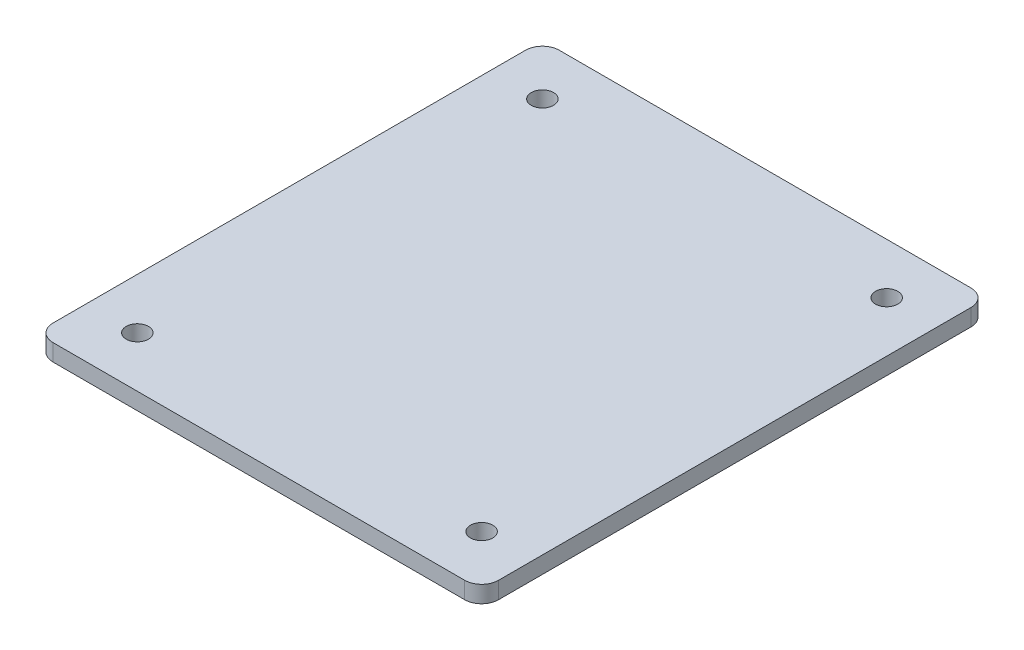
ISO-10303-21;
HEADER;
FILE_DESCRIPTION(('STEP AP214'),'2;1');
FILE_NAME('part.step','',(''),(''),'','','');
FILE_SCHEMA(('AUTOMOTIVE_DESIGN { 1 0 10303 214 1 1 1 1 }'));
ENDSEC;
DATA;
#1=APPLICATION_CONTEXT('core data for automotive mechanical design processes');
#2=APPLICATION_PROTOCOL_DEFINITION('international standard','automotive_design',2000,#1);
#3=PRODUCT_CONTEXT('',#1,'mechanical');
#4=PRODUCT('Part','Part','',(#3));
#5=PRODUCT_RELATED_PRODUCT_CATEGORY('part','',(#4));
#6=PRODUCT_DEFINITION_FORMATION('','',#4);
#7=PRODUCT_DEFINITION_CONTEXT('part definition',#1,'design');
#8=PRODUCT_DEFINITION('design','',#6,#7);
#9=PRODUCT_DEFINITION_SHAPE('','',#8);
#10=(LENGTH_UNIT() NAMED_UNIT(*) SI_UNIT(.MILLI.,.METRE.));
#11=(NAMED_UNIT(*) PLANE_ANGLE_UNIT() SI_UNIT($,.RADIAN.));
#12=(NAMED_UNIT(*) SI_UNIT($,.STERADIAN.) SOLID_ANGLE_UNIT());
#13=UNCERTAINTY_MEASURE_WITH_UNIT(LENGTH_MEASURE(1.E-05),#10,'distance_accuracy_value','');
#14=(GEOMETRIC_REPRESENTATION_CONTEXT(3) GLOBAL_UNCERTAINTY_ASSIGNED_CONTEXT((#13)) GLOBAL_UNIT_ASSIGNED_CONTEXT((#10,
#11,#12)) REPRESENTATION_CONTEXT('',''));
#15=CARTESIAN_POINT('',(0.,0.,0.));
#16=DIRECTION('',(0.,0.,1.));
#17=DIRECTION('',(1.,0.,0.));
#18=AXIS2_PLACEMENT_3D('',#15,#16,#17);
#19=CARTESIAN_POINT('',(0.,5.,0.));
#20=DIRECTION('',(1.,0.,0.));
#21=DIRECTION('',(0.,0.,-1.));
#22=AXIS2_PLACEMENT_3D('',#19,#20,#21);
#23=PLANE('',#22);
#24=DIRECTION('',(0.,0.,1.));
#25=VECTOR('',#24,1.);
#26=CARTESIAN_POINT('',(0.,0.,0.));
#27=LINE('',#26,#25);
#28=CARTESIAN_POINT('',(0.,0.,-145.));
#29=VERTEX_POINT('',#28);
#30=CARTESIAN_POINT('',(0.,0.,-5.));
#31=VERTEX_POINT('',#30);
#32=EDGE_CURVE('E156',#29,#31,#27,.T.);
#33=ORIENTED_EDGE('',*,*,#32,.T.);
#34=DIRECTION('',(0.,-1.,0.));
#35=VECTOR('',#34,1.);
#36=CARTESIAN_POINT('',(0.,5.,-5.));
#37=LINE('',#36,#35);
#38=CARTESIAN_POINT('',(0.,5.,-5.));
#39=VERTEX_POINT('',#38);
#40=EDGE_CURVE('E11',#31,#39,#37,.F.);
#41=ORIENTED_EDGE('',*,*,#40,.T.);
#42=DIRECTION('',(0.,0.,1.));
#43=VECTOR('',#42,1.);
#44=CARTESIAN_POINT('',(0.,5.,0.));
#45=LINE('',#44,#43);
#46=CARTESIAN_POINT('',(0.,5.,-145.));
#47=VERTEX_POINT('',#46);
#48=EDGE_CURVE('E124',#47,#39,#45,.T.);
#49=ORIENTED_EDGE('',*,*,#48,.F.);
#50=DIRECTION('',(0.,-1.,0.));
#51=VECTOR('',#50,1.);
#52=CARTESIAN_POINT('',(0.,5.,-145.));
#53=LINE('',#52,#51);
#54=EDGE_CURVE('E40',#47,#29,#53,.T.);
#55=ORIENTED_EDGE('',*,*,#54,.T.);
#56=EDGE_LOOP('',(#33,#41,#49,#55));
#57=FACE_BOUND('',#56,.T.);
#58=ADVANCED_FACE('F32',(#57),#23,.F.);
#59=CARTESIAN_POINT('',(0.,5.,0.));
#60=DIRECTION('',(0.,0.,-1.));
#61=DIRECTION('',(-1.,0.,0.));
#62=AXIS2_PLACEMENT_3D('',#59,#60,#61);
#63=PLANE('',#62);
#64=DIRECTION('',(1.,0.,0.));
#65=VECTOR('',#64,1.);
#66=CARTESIAN_POINT('',(0.,0.,0.));
#67=LINE('',#66,#65);
#68=CARTESIAN_POINT('',(5.,0.,0.));
#69=VERTEX_POINT('',#68);
#70=CARTESIAN_POINT('',(127.,0.,0.));
#71=VERTEX_POINT('',#70);
#72=EDGE_CURVE('E129',#69,#71,#67,.T.);
#73=ORIENTED_EDGE('',*,*,#72,.T.);
#74=DIRECTION('',(0.,-1.,0.));
#75=VECTOR('',#74,1.);
#76=CARTESIAN_POINT('',(127.,5.,0.));
#77=LINE('',#76,#75);
#78=CARTESIAN_POINT('',(127.,5.,0.));
#79=VERTEX_POINT('',#78);
#80=EDGE_CURVE('E47',#71,#79,#77,.F.);
#81=ORIENTED_EDGE('',*,*,#80,.T.);
#82=DIRECTION('',(1.,0.,0.));
#83=VECTOR('',#82,1.);
#84=CARTESIAN_POINT('',(0.,5.,0.));
#85=LINE('',#84,#83);
#86=CARTESIAN_POINT('',(5.,5.,0.));
#87=VERTEX_POINT('',#86);
#88=EDGE_CURVE('E127',#87,#79,#85,.T.);
#89=ORIENTED_EDGE('',*,*,#88,.F.);
#90=DIRECTION('',(0.,-1.,0.));
#91=VECTOR('',#90,1.);
#92=CARTESIAN_POINT('',(5.,5.,0.));
#93=LINE('',#92,#91);
#94=EDGE_CURVE('E148',#87,#69,#93,.T.);
#95=ORIENTED_EDGE('',*,*,#94,.T.);
#96=EDGE_LOOP('',(#73,#81,#89,#95));
#97=FACE_BOUND('',#96,.T.);
#98=ADVANCED_FACE('F223',(#97),#63,.F.);
#99=CARTESIAN_POINT('',(132.,5.,0.));
#100=DIRECTION('',(-1.,0.,0.));
#101=DIRECTION('',(0.,0.,1.));
#102=AXIS2_PLACEMENT_3D('',#99,#100,#101);
#103=PLANE('',#102);
#104=DIRECTION('',(0.,0.,-1.));
#105=VECTOR('',#104,1.);
#106=CARTESIAN_POINT('',(132.,0.,0.));
#107=LINE('',#106,#105);
#108=CARTESIAN_POINT('',(132.,0.,-5.));
#109=VERTEX_POINT('',#108);
#110=CARTESIAN_POINT('',(132.,0.,-145.));
#111=VERTEX_POINT('',#110);
#112=EDGE_CURVE('E125',#109,#111,#107,.T.);
#113=ORIENTED_EDGE('',*,*,#112,.T.);
#114=DIRECTION('',(0.,-1.,0.));
#115=VECTOR('',#114,1.);
#116=CARTESIAN_POINT('',(132.,5.,-145.));
#117=LINE('',#116,#115);
#118=CARTESIAN_POINT('',(132.,5.,-145.));
#119=VERTEX_POINT('',#118);
#120=EDGE_CURVE('E103',#111,#119,#117,.F.);
#121=ORIENTED_EDGE('',*,*,#120,.T.);
#122=DIRECTION('',(0.,0.,-1.));
#123=VECTOR('',#122,1.);
#124=CARTESIAN_POINT('',(132.,5.,0.));
#125=LINE('',#124,#123);
#126=CARTESIAN_POINT('',(132.,5.,-5.));
#127=VERTEX_POINT('',#126);
#128=EDGE_CURVE('E168',#127,#119,#125,.T.);
#129=ORIENTED_EDGE('',*,*,#128,.F.);
#130=DIRECTION('',(0.,-1.,0.));
#131=VECTOR('',#130,1.);
#132=CARTESIAN_POINT('',(132.,5.,-5.));
#133=LINE('',#132,#131);
#134=EDGE_CURVE('E108',#127,#109,#133,.T.);
#135=ORIENTED_EDGE('',*,*,#134,.T.);
#136=EDGE_LOOP('',(#113,#121,#129,#135));
#137=FACE_BOUND('',#136,.T.);
#138=ADVANCED_FACE('F220',(#137),#103,.F.);
#139=CARTESIAN_POINT('',(0.,5.,-150.));
#140=DIRECTION('',(0.,0.,1.));
#141=DIRECTION('',(1.,0.,0.));
#142=AXIS2_PLACEMENT_3D('',#139,#140,#141);
#143=PLANE('',#142);
#144=DIRECTION('',(-1.,0.,0.));
#145=VECTOR('',#144,1.);
#146=CARTESIAN_POINT('',(0.,5.,-150.));
#147=LINE('',#146,#145);
#148=CARTESIAN_POINT('',(127.,5.,-150.));
#149=VERTEX_POINT('',#148);
#150=CARTESIAN_POINT('',(5.,5.,-150.));
#151=VERTEX_POINT('',#150);
#152=EDGE_CURVE('E118',#149,#151,#147,.T.);
#153=ORIENTED_EDGE('',*,*,#152,.F.);
#154=DIRECTION('',(0.,-1.,0.));
#155=VECTOR('',#154,1.);
#156=CARTESIAN_POINT('',(127.,5.,-150.));
#157=LINE('',#156,#155);
#158=CARTESIAN_POINT('',(127.,0.,-150.));
#159=VERTEX_POINT('',#158);
#160=EDGE_CURVE('E102',#149,#159,#157,.T.);
#161=ORIENTED_EDGE('',*,*,#160,.T.);
#162=DIRECTION('',(-1.,0.,0.));
#163=VECTOR('',#162,1.);
#164=CARTESIAN_POINT('',(0.,0.,-150.));
#165=LINE('',#164,#163);
#166=CARTESIAN_POINT('',(5.,0.,-150.));
#167=VERTEX_POINT('',#166);
#168=EDGE_CURVE('E115',#159,#167,#165,.T.);
#169=ORIENTED_EDGE('',*,*,#168,.T.);
#170=DIRECTION('',(0.,-1.,0.));
#171=VECTOR('',#170,1.);
#172=CARTESIAN_POINT('',(5.,5.,-150.));
#173=LINE('',#172,#171);
#174=EDGE_CURVE('E120',#167,#151,#173,.F.);
#175=ORIENTED_EDGE('',*,*,#174,.T.);
#176=EDGE_LOOP('',(#153,#161,#169,#175));
#177=FACE_BOUND('',#176,.T.);
#178=ADVANCED_FACE('F114',(#177),#143,.F.);
#179=CARTESIAN_POINT('',(0.,5.,0.));
#180=DIRECTION('',(0.,-1.,0.));
#181=DIRECTION('',(0.,0.,-1.));
#182=AXIS2_PLACEMENT_3D('',#179,#180,#181);
#183=PLANE('',#182);
#184=CARTESIAN_POINT('',(15.,5.,-15.));
#185=DIRECTION('',(0.,-1.,0.));
#186=DIRECTION('',(0.,0.,-1.));
#187=AXIS2_PLACEMENT_3D('',#184,#185,#186);
#188=CIRCLE('',#187,3.3);
#189=CARTESIAN_POINT('',(15.,5.,-18.3));
#190=VERTEX_POINT('',#189);
#191=EDGE_CURVE('E186',#190,#190,#188,.T.);
#192=ORIENTED_EDGE('',*,*,#191,.T.);
#193=EDGE_LOOP('',(#192));
#194=FACE_BOUND('',#193,.T.);
#195=CARTESIAN_POINT('',(117.,5.,-15.));
#196=DIRECTION('',(0.,-1.,0.));
#197=DIRECTION('',(0.,0.,-1.));
#198=AXIS2_PLACEMENT_3D('',#195,#196,#197);
#199=CIRCLE('',#198,3.3);
#200=CARTESIAN_POINT('',(117.,5.,-18.3));
#201=VERTEX_POINT('',#200);
#202=EDGE_CURVE('E180',#201,#201,#199,.T.);
#203=ORIENTED_EDGE('',*,*,#202,.T.);
#204=EDGE_LOOP('',(#203));
#205=FACE_BOUND('',#204,.T.);
#206=CARTESIAN_POINT('',(117.,5.,-135.));
#207=DIRECTION('',(0.,-1.,0.));
#208=DIRECTION('',(0.,0.,-1.));
#209=AXIS2_PLACEMENT_3D('',#206,#207,#208);
#210=CIRCLE('',#209,3.3);
#211=CARTESIAN_POINT('',(117.,5.,-138.3));
#212=VERTEX_POINT('',#211);
#213=EDGE_CURVE('E174',#212,#212,#210,.T.);
#214=ORIENTED_EDGE('',*,*,#213,.T.);
#215=EDGE_LOOP('',(#214));
#216=FACE_BOUND('',#215,.T.);
#217=CARTESIAN_POINT('',(15.,5.,-135.));
#218=DIRECTION('',(0.,-1.,0.));
#219=DIRECTION('',(0.,0.,-1.));
#220=AXIS2_PLACEMENT_3D('',#217,#218,#219);
#221=CIRCLE('',#220,3.3);
#222=CARTESIAN_POINT('',(15.,5.,-138.3));
#223=VERTEX_POINT('',#222);
#224=EDGE_CURVE('E161',#223,#223,#221,.T.);
#225=ORIENTED_EDGE('',*,*,#224,.T.);
#226=EDGE_LOOP('',(#225));
#227=FACE_BOUND('',#226,.T.);
#228=ORIENTED_EDGE('',*,*,#128,.T.);
#229=CARTESIAN_POINT('',(127.,5.,-145.));
#230=DIRECTION('',(0.,-1.,0.));
#231=DIRECTION('',(0.,0.,-1.));
#232=AXIS2_PLACEMENT_3D('',#229,#230,#231);
#233=CIRCLE('',#232,5.);
#234=EDGE_CURVE('E146',#119,#149,#233,.F.);
#235=ORIENTED_EDGE('',*,*,#234,.T.);
#236=ORIENTED_EDGE('',*,*,#152,.T.);
#237=CARTESIAN_POINT('',(5.,5.,-145.));
#238=DIRECTION('',(0.,-1.,0.));
#239=DIRECTION('',(0.,0.,-1.));
#240=AXIS2_PLACEMENT_3D('',#237,#238,#239);
#241=CIRCLE('',#240,5.);
#242=EDGE_CURVE('E141',#151,#47,#241,.F.);
#243=ORIENTED_EDGE('',*,*,#242,.T.);
#244=ORIENTED_EDGE('',*,*,#48,.T.);
#245=CARTESIAN_POINT('',(5.,5.,-5.));
#246=DIRECTION('',(0.,-1.,0.));
#247=DIRECTION('',(0.,0.,-1.));
#248=AXIS2_PLACEMENT_3D('',#245,#246,#247);
#249=CIRCLE('',#248,5.);
#250=EDGE_CURVE('E54',#39,#87,#249,.F.);
#251=ORIENTED_EDGE('',*,*,#250,.T.);
#252=ORIENTED_EDGE('',*,*,#88,.T.);
#253=CARTESIAN_POINT('',(127.,5.,-5.));
#254=DIRECTION('',(0.,-1.,0.));
#255=DIRECTION('',(0.,0.,-1.));
#256=AXIS2_PLACEMENT_3D('',#253,#254,#255);
#257=CIRCLE('',#256,5.);
#258=EDGE_CURVE('E144',#79,#127,#257,.F.);
#259=ORIENTED_EDGE('',*,*,#258,.T.);
#260=EDGE_LOOP('',(#228,#235,#236,#243,#244,#251,#252,#259));
#261=FACE_BOUND('',#260,.T.);
#262=ADVANCED_FACE('F199',(#194,#205,#216,#227,#261),#183,.F.);
#263=CARTESIAN_POINT('',(0.,0.,0.));
#264=DIRECTION('',(0.,-1.,0.));
#265=DIRECTION('',(0.,0.,-1.));
#266=AXIS2_PLACEMENT_3D('',#263,#264,#265);
#267=PLANE('',#266);
#268=CARTESIAN_POINT('',(15.,0.,-15.));
#269=DIRECTION('',(0.,-1.,0.));
#270=DIRECTION('',(0.,0.,-1.));
#271=AXIS2_PLACEMENT_3D('',#268,#269,#270);
#272=CIRCLE('',#271,3.3);
#273=CARTESIAN_POINT('',(15.,0.,-18.3));
#274=VERTEX_POINT('',#273);
#275=EDGE_CURVE('E189',#274,#274,#272,.T.);
#276=ORIENTED_EDGE('',*,*,#275,.F.);
#277=EDGE_LOOP('',(#276));
#278=FACE_BOUND('',#277,.T.);
#279=CARTESIAN_POINT('',(117.,0.,-15.));
#280=DIRECTION('',(0.,-1.,0.));
#281=DIRECTION('',(0.,0.,-1.));
#282=AXIS2_PLACEMENT_3D('',#279,#280,#281);
#283=CIRCLE('',#282,3.3);
#284=CARTESIAN_POINT('',(117.,0.,-18.3));
#285=VERTEX_POINT('',#284);
#286=EDGE_CURVE('E183',#285,#285,#283,.T.);
#287=ORIENTED_EDGE('',*,*,#286,.F.);
#288=EDGE_LOOP('',(#287));
#289=FACE_BOUND('',#288,.T.);
#290=CARTESIAN_POINT('',(117.,0.,-135.));
#291=DIRECTION('',(0.,-1.,0.));
#292=DIRECTION('',(0.,0.,-1.));
#293=AXIS2_PLACEMENT_3D('',#290,#291,#292);
#294=CIRCLE('',#293,3.3);
#295=CARTESIAN_POINT('',(117.,0.,-138.3));
#296=VERTEX_POINT('',#295);
#297=EDGE_CURVE('E177',#296,#296,#294,.T.);
#298=ORIENTED_EDGE('',*,*,#297,.F.);
#299=EDGE_LOOP('',(#298));
#300=FACE_BOUND('',#299,.T.);
#301=CARTESIAN_POINT('',(15.,0.,-135.));
#302=DIRECTION('',(0.,-1.,0.));
#303=DIRECTION('',(0.,0.,-1.));
#304=AXIS2_PLACEMENT_3D('',#301,#302,#303);
#305=CIRCLE('',#304,3.3);
#306=CARTESIAN_POINT('',(15.,0.,-138.3));
#307=VERTEX_POINT('',#306);
#308=EDGE_CURVE('E164',#307,#307,#305,.T.);
#309=ORIENTED_EDGE('',*,*,#308,.F.);
#310=EDGE_LOOP('',(#309));
#311=FACE_BOUND('',#310,.T.);
#312=ORIENTED_EDGE('',*,*,#168,.F.);
#313=CARTESIAN_POINT('',(127.,0.,-145.));
#314=DIRECTION('',(0.,-1.,0.));
#315=DIRECTION('',(0.,0.,-1.));
#316=AXIS2_PLACEMENT_3D('',#313,#314,#315);
#317=CIRCLE('',#316,5.);
#318=EDGE_CURVE('E98',#159,#111,#317,.T.);
#319=ORIENTED_EDGE('',*,*,#318,.T.);
#320=ORIENTED_EDGE('',*,*,#112,.F.);
#321=CARTESIAN_POINT('',(127.,0.,-5.));
#322=DIRECTION('',(0.,-1.,0.));
#323=DIRECTION('',(0.,0.,-1.));
#324=AXIS2_PLACEMENT_3D('',#321,#322,#323);
#325=CIRCLE('',#324,5.);
#326=EDGE_CURVE('E109',#109,#71,#325,.T.);
#327=ORIENTED_EDGE('',*,*,#326,.T.);
#328=ORIENTED_EDGE('',*,*,#72,.F.);
#329=CARTESIAN_POINT('',(5.,0.,-5.));
#330=DIRECTION('',(0.,-1.,0.));
#331=DIRECTION('',(0.,0.,-1.));
#332=AXIS2_PLACEMENT_3D('',#329,#330,#331);
#333=CIRCLE('',#332,5.);
#334=EDGE_CURVE('E135',#69,#31,#333,.T.);
#335=ORIENTED_EDGE('',*,*,#334,.T.);
#336=ORIENTED_EDGE('',*,*,#32,.F.);
#337=CARTESIAN_POINT('',(5.,0.,-145.));
#338=DIRECTION('',(0.,-1.,0.));
#339=DIRECTION('',(0.,0.,-1.));
#340=AXIS2_PLACEMENT_3D('',#337,#338,#339);
#341=CIRCLE('',#340,5.);
#342=EDGE_CURVE('E119',#29,#167,#341,.T.);
#343=ORIENTED_EDGE('',*,*,#342,.T.);
#344=EDGE_LOOP('',(#312,#319,#320,#327,#328,#335,#336,#343));
#345=FACE_BOUND('',#344,.T.);
#346=ADVANCED_FACE('F122',(#278,#289,#300,#311,#345),#267,.T.);
#347=CARTESIAN_POINT('',(15.,0.,-135.));
#348=DIRECTION('',(0.,-1.,0.));
#349=DIRECTION('',(0.,0.,-1.));
#350=AXIS2_PLACEMENT_3D('',#347,#348,#349);
#351=CYLINDRICAL_SURFACE('',#350,3.3);
#352=ORIENTED_EDGE('',*,*,#308,.T.);
#353=EDGE_LOOP('',(#352));
#354=FACE_BOUND('',#353,.T.);
#355=ORIENTED_EDGE('',*,*,#224,.F.);
#356=EDGE_LOOP('',(#355));
#357=FACE_BOUND('',#356,.T.);
#358=ADVANCED_FACE('F198',(#354,#357),#351,.F.);
#359=CARTESIAN_POINT('',(117.,0.,-135.));
#360=DIRECTION('',(0.,-1.,0.));
#361=DIRECTION('',(0.,0.,-1.));
#362=AXIS2_PLACEMENT_3D('',#359,#360,#361);
#363=CYLINDRICAL_SURFACE('',#362,3.3);
#364=ORIENTED_EDGE('',*,*,#297,.T.);
#365=EDGE_LOOP('',(#364));
#366=FACE_BOUND('',#365,.T.);
#367=ORIENTED_EDGE('',*,*,#213,.F.);
#368=EDGE_LOOP('',(#367));
#369=FACE_BOUND('',#368,.T.);
#370=ADVANCED_FACE('F209',(#366,#369),#363,.F.);
#371=CARTESIAN_POINT('',(117.,0.,-15.));
#372=DIRECTION('',(0.,-1.,0.));
#373=DIRECTION('',(0.,0.,-1.));
#374=AXIS2_PLACEMENT_3D('',#371,#372,#373);
#375=CYLINDRICAL_SURFACE('',#374,3.3);
#376=ORIENTED_EDGE('',*,*,#286,.T.);
#377=EDGE_LOOP('',(#376));
#378=FACE_BOUND('',#377,.T.);
#379=ORIENTED_EDGE('',*,*,#202,.F.);
#380=EDGE_LOOP('',(#379));
#381=FACE_BOUND('',#380,.T.);
#382=ADVANCED_FACE('F271',(#378,#381),#375,.F.);
#383=CARTESIAN_POINT('',(15.,0.,-15.));
#384=DIRECTION('',(0.,-1.,0.));
#385=DIRECTION('',(0.,0.,-1.));
#386=AXIS2_PLACEMENT_3D('',#383,#384,#385);
#387=CYLINDRICAL_SURFACE('',#386,3.3);
#388=ORIENTED_EDGE('',*,*,#275,.T.);
#389=EDGE_LOOP('',(#388));
#390=FACE_BOUND('',#389,.T.);
#391=ORIENTED_EDGE('',*,*,#191,.F.);
#392=EDGE_LOOP('',(#391));
#393=FACE_BOUND('',#392,.T.);
#394=ADVANCED_FACE('F193',(#390,#393),#387,.F.);
#395=CARTESIAN_POINT('',(127.,5.,-145.));
#396=DIRECTION('',(0.,-1.,0.));
#397=DIRECTION('',(0.,0.,-1.));
#398=AXIS2_PLACEMENT_3D('',#395,#396,#397);
#399=CYLINDRICAL_SURFACE('',#398,5.);
#400=ORIENTED_EDGE('',*,*,#234,.F.);
#401=ORIENTED_EDGE('',*,*,#120,.F.);
#402=ORIENTED_EDGE('',*,*,#318,.F.);
#403=ORIENTED_EDGE('',*,*,#160,.F.);
#404=EDGE_LOOP('',(#400,#401,#402,#403));
#405=FACE_BOUND('',#404,.T.);
#406=ADVANCED_FACE('F101',(#405),#399,.T.);
#407=CARTESIAN_POINT('',(127.,5.,-5.));
#408=DIRECTION('',(0.,-1.,0.));
#409=DIRECTION('',(0.,0.,-1.));
#410=AXIS2_PLACEMENT_3D('',#407,#408,#409);
#411=CYLINDRICAL_SURFACE('',#410,5.);
#412=ORIENTED_EDGE('',*,*,#258,.F.);
#413=ORIENTED_EDGE('',*,*,#80,.F.);
#414=ORIENTED_EDGE('',*,*,#326,.F.);
#415=ORIENTED_EDGE('',*,*,#134,.F.);
#416=EDGE_LOOP('',(#412,#413,#414,#415));
#417=FACE_BOUND('',#416,.T.);
#418=ADVANCED_FACE('F222',(#417),#411,.T.);
#419=CARTESIAN_POINT('',(5.,5.,-5.));
#420=DIRECTION('',(0.,-1.,0.));
#421=DIRECTION('',(0.,0.,-1.));
#422=AXIS2_PLACEMENT_3D('',#419,#420,#421);
#423=CYLINDRICAL_SURFACE('',#422,5.);
#424=ORIENTED_EDGE('',*,*,#250,.F.);
#425=ORIENTED_EDGE('',*,*,#40,.F.);
#426=ORIENTED_EDGE('',*,*,#334,.F.);
#427=ORIENTED_EDGE('',*,*,#94,.F.);
#428=EDGE_LOOP('',(#424,#425,#426,#427));
#429=FACE_BOUND('',#428,.T.);
#430=ADVANCED_FACE('F226',(#429),#423,.T.);
#431=CARTESIAN_POINT('',(5.,5.,-145.));
#432=DIRECTION('',(0.,-1.,0.));
#433=DIRECTION('',(0.,0.,-1.));
#434=AXIS2_PLACEMENT_3D('',#431,#432,#433);
#435=CYLINDRICAL_SURFACE('',#434,5.);
#436=ORIENTED_EDGE('',*,*,#242,.F.);
#437=ORIENTED_EDGE('',*,*,#174,.F.);
#438=ORIENTED_EDGE('',*,*,#342,.F.);
#439=ORIENTED_EDGE('',*,*,#54,.F.);
#440=EDGE_LOOP('',(#436,#437,#438,#439));
#441=FACE_BOUND('',#440,.T.);
#442=ADVANCED_FACE('F34',(#441),#435,.T.);
#443=CLOSED_SHELL('',(#58,#98,#138,#178,#262,#346,#358,#370,#382,#394,#406,#418,#430,#442));
#444=MANIFOLD_SOLID_BREP('B2',#443);
#445=ADVANCED_BREP_SHAPE_REPRESENTATION('',(#18,#444),#14);
#446=SHAPE_DEFINITION_REPRESENTATION(#9,#445);
ENDSEC;
END-ISO-10303-21;
